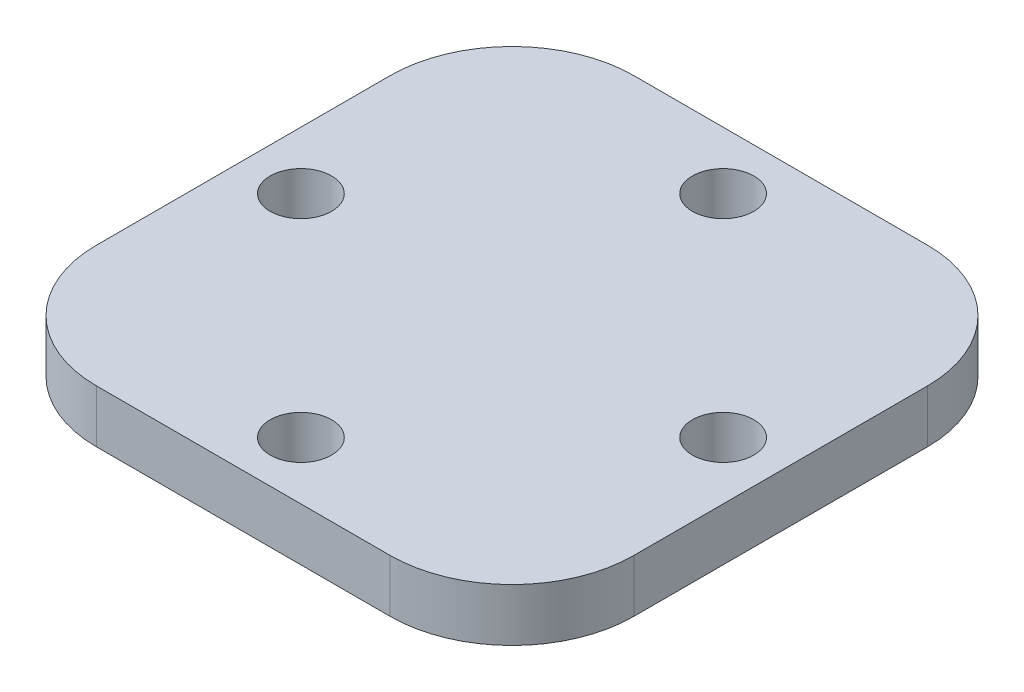
ISO-10303-21;
HEADER;
FILE_DESCRIPTION(('STEP AP214'),'2;1');
FILE_NAME('part.step','',(''),(''),'','','');
FILE_SCHEMA(('AUTOMOTIVE_DESIGN { 1 0 10303 214 1 1 1 1 }'));
ENDSEC;
DATA;
#1=APPLICATION_CONTEXT('core data for automotive mechanical design processes');
#2=APPLICATION_PROTOCOL_DEFINITION('international standard','automotive_design',2000,#1);
#3=PRODUCT_CONTEXT('',#1,'mechanical');
#4=PRODUCT('Part','Part','',(#3));
#5=PRODUCT_RELATED_PRODUCT_CATEGORY('part','',(#4));
#6=PRODUCT_DEFINITION_FORMATION('','',#4);
#7=PRODUCT_DEFINITION_CONTEXT('part definition',#1,'design');
#8=PRODUCT_DEFINITION('design','',#6,#7);
#9=PRODUCT_DEFINITION_SHAPE('','',#8);
#10=(LENGTH_UNIT() NAMED_UNIT(*) SI_UNIT(.MILLI.,.METRE.));
#11=(NAMED_UNIT(*) PLANE_ANGLE_UNIT() SI_UNIT($,.RADIAN.));
#12=(NAMED_UNIT(*) SI_UNIT($,.STERADIAN.) SOLID_ANGLE_UNIT());
#13=UNCERTAINTY_MEASURE_WITH_UNIT(LENGTH_MEASURE(1.E-05),#10,'distance_accuracy_value','');
#14=(GEOMETRIC_REPRESENTATION_CONTEXT(3) GLOBAL_UNCERTAINTY_ASSIGNED_CONTEXT((#13)) GLOBAL_UNIT_ASSIGNED_CONTEXT((#10,
#11,#12)) REPRESENTATION_CONTEXT('',''));
#15=CARTESIAN_POINT('',(0.,0.,0.));
#16=DIRECTION('',(0.,0.,1.));
#17=DIRECTION('',(1.,0.,0.));
#18=AXIS2_PLACEMENT_3D('',#15,#16,#17);
#19=CARTESIAN_POINT('',(7.65,2.75,-7.65));
#20=DIRECTION('',(0.,-1.,0.));
#21=DIRECTION('',(0.,0.,-1.));
#22=AXIS2_PLACEMENT_3D('',#19,#20,#21);
#23=PLANE('',#22);
#24=CARTESIAN_POINT('',(7.65,2.75,-7.65));
#25=DIRECTION('',(0.,1.,0.));
#26=DIRECTION('',(0.,0.,-1.));
#27=AXIS2_PLACEMENT_3D('',#24,#25,#26);
#28=CIRCLE('',#27,6.35);
#29=CARTESIAN_POINT('',(14.,2.75,-7.65));
#30=VERTEX_POINT('',#29);
#31=CARTESIAN_POINT('',(7.65,2.75,-14.));
#32=VERTEX_POINT('',#31);
#33=EDGE_CURVE('E148',#30,#32,#28,.T.);
#34=ORIENTED_EDGE('',*,*,#33,.T.);
#35=DIRECTION('',(-1.,0.,0.));
#36=VECTOR('',#35,1.);
#37=CARTESIAN_POINT('',(-7.65,2.75,-14.));
#38=LINE('',#37,#36);
#39=CARTESIAN_POINT('',(-7.65,2.75,-14.));
#40=VERTEX_POINT('',#39);
#41=EDGE_CURVE('E96',#32,#40,#38,.T.);
#42=ORIENTED_EDGE('',*,*,#41,.T.);
#43=CARTESIAN_POINT('',(-7.65,2.75,-7.65));
#44=DIRECTION('',(0.,1.,0.));
#45=DIRECTION('',(0.,0.,-1.));
#46=AXIS2_PLACEMENT_3D('',#43,#44,#45);
#47=CIRCLE('',#46,6.35);
#48=CARTESIAN_POINT('',(-14.,2.75,-7.65));
#49=VERTEX_POINT('',#48);
#50=EDGE_CURVE('E163',#40,#49,#47,.T.);
#51=ORIENTED_EDGE('',*,*,#50,.T.);
#52=DIRECTION('',(0.,0.,1.));
#53=VECTOR('',#52,1.);
#54=CARTESIAN_POINT('',(-14.,2.75,7.65));
#55=LINE('',#54,#53);
#56=CARTESIAN_POINT('',(-14.,2.75,7.65));
#57=VERTEX_POINT('',#56);
#58=EDGE_CURVE('E176',#49,#57,#55,.T.);
#59=ORIENTED_EDGE('',*,*,#58,.T.);
#60=CARTESIAN_POINT('',(-7.65,2.75,7.65));
#61=DIRECTION('',(0.,1.,0.));
#62=DIRECTION('',(0.,0.,-1.));
#63=AXIS2_PLACEMENT_3D('',#60,#61,#62);
#64=CIRCLE('',#63,6.35);
#65=CARTESIAN_POINT('',(-7.65,2.75,14.));
#66=VERTEX_POINT('',#65);
#67=EDGE_CURVE('E115',#57,#66,#64,.T.);
#68=ORIENTED_EDGE('',*,*,#67,.T.);
#69=DIRECTION('',(1.,0.,0.));
#70=VECTOR('',#69,1.);
#71=CARTESIAN_POINT('',(-7.65,2.75,14.));
#72=LINE('',#71,#70);
#73=CARTESIAN_POINT('',(7.65,2.75,14.));
#74=VERTEX_POINT('',#73);
#75=EDGE_CURVE('E109',#66,#74,#72,.T.);
#76=ORIENTED_EDGE('',*,*,#75,.T.);
#77=CARTESIAN_POINT('',(7.65,2.75,7.65));
#78=DIRECTION('',(0.,1.,0.));
#79=DIRECTION('',(0.,0.,-1.));
#80=AXIS2_PLACEMENT_3D('',#77,#78,#79);
#81=CIRCLE('',#80,6.35);
#82=CARTESIAN_POINT('',(14.,2.75,7.65));
#83=VERTEX_POINT('',#82);
#84=EDGE_CURVE('E113',#74,#83,#81,.T.);
#85=ORIENTED_EDGE('',*,*,#84,.T.);
#86=DIRECTION('',(0.,0.,-1.));
#87=VECTOR('',#86,1.);
#88=CARTESIAN_POINT('',(14.,2.75,7.65));
#89=LINE('',#88,#87);
#90=EDGE_CURVE('E53',#83,#30,#89,.T.);
#91=ORIENTED_EDGE('',*,*,#90,.T.);
#92=EDGE_LOOP('',(#34,#42,#51,#59,#68,#76,#85,#91));
#93=FACE_BOUND('',#92,.T.);
#94=CARTESIAN_POINT('',(-11.,2.75,0.));
#95=DIRECTION('',(0.,1.,0.));
#96=DIRECTION('',(0.,0.,1.));
#97=AXIS2_PLACEMENT_3D('',#94,#95,#96);
#98=CIRCLE('',#97,1.59999999999999);
#99=CARTESIAN_POINT('',(-11.,2.75,1.59999999999999));
#100=VERTEX_POINT('',#99);
#101=EDGE_CURVE('E137',#100,#100,#98,.T.);
#102=ORIENTED_EDGE('',*,*,#101,.F.);
#103=EDGE_LOOP('',(#102));
#104=FACE_BOUND('',#103,.T.);
#105=CARTESIAN_POINT('',(0.,2.75,11.));
#106=DIRECTION('',(0.,1.,0.));
#107=DIRECTION('',(0.,0.,1.));
#108=AXIS2_PLACEMENT_3D('',#105,#106,#107);
#109=CIRCLE('',#108,1.59999999999999);
#110=CARTESIAN_POINT('',(0.,2.75,12.6));
#111=VERTEX_POINT('',#110);
#112=EDGE_CURVE('E185',#111,#111,#109,.T.);
#113=ORIENTED_EDGE('',*,*,#112,.F.);
#114=EDGE_LOOP('',(#113));
#115=FACE_BOUND('',#114,.T.);
#116=CARTESIAN_POINT('',(11.,2.75,0.));
#117=DIRECTION('',(0.,1.,0.));
#118=DIRECTION('',(0.,0.,1.));
#119=AXIS2_PLACEMENT_3D('',#116,#117,#118);
#120=CIRCLE('',#119,1.6);
#121=CARTESIAN_POINT('',(11.,2.75,1.6));
#122=VERTEX_POINT('',#121);
#123=EDGE_CURVE('E191',#122,#122,#120,.T.);
#124=ORIENTED_EDGE('',*,*,#123,.F.);
#125=EDGE_LOOP('',(#124));
#126=FACE_BOUND('',#125,.T.);
#127=CARTESIAN_POINT('',(0.,2.75,-11.));
#128=DIRECTION('',(0.,1.,0.));
#129=DIRECTION('',(0.,0.,1.));
#130=AXIS2_PLACEMENT_3D('',#127,#128,#129);
#131=CIRCLE('',#130,1.6);
#132=CARTESIAN_POINT('',(0.,2.75,-9.4));
#133=VERTEX_POINT('',#132);
#134=EDGE_CURVE('E197',#133,#133,#131,.T.);
#135=ORIENTED_EDGE('',*,*,#134,.F.);
#136=EDGE_LOOP('',(#135));
#137=FACE_BOUND('',#136,.T.);
#138=ADVANCED_FACE('F36',(#93,#104,#115,#126,#137),#23,.F.);
#139=CARTESIAN_POINT('',(7.65,0.,-7.65));
#140=DIRECTION('',(0.,-1.,0.));
#141=DIRECTION('',(0.,0.,-1.));
#142=AXIS2_PLACEMENT_3D('',#139,#140,#141);
#143=PLANE('',#142);
#144=CARTESIAN_POINT('',(11.,0.,0.));
#145=DIRECTION('',(0.,1.,0.));
#146=DIRECTION('',(0.,0.,1.));
#147=AXIS2_PLACEMENT_3D('',#144,#145,#146);
#148=CIRCLE('',#147,1.6);
#149=CARTESIAN_POINT('',(11.,0.,1.6));
#150=VERTEX_POINT('',#149);
#151=EDGE_CURVE('E194',#150,#150,#148,.T.);
#152=ORIENTED_EDGE('',*,*,#151,.T.);
#153=EDGE_LOOP('',(#152));
#154=FACE_BOUND('',#153,.T.);
#155=CARTESIAN_POINT('',(-11.,0.,0.));
#156=DIRECTION('',(0.,1.,0.));
#157=DIRECTION('',(0.,0.,1.));
#158=AXIS2_PLACEMENT_3D('',#155,#156,#157);
#159=CIRCLE('',#158,1.59999999999999);
#160=CARTESIAN_POINT('',(-11.,0.,1.59999999999999));
#161=VERTEX_POINT('',#160);
#162=EDGE_CURVE('E182',#161,#161,#159,.T.);
#163=ORIENTED_EDGE('',*,*,#162,.T.);
#164=EDGE_LOOP('',(#163));
#165=FACE_BOUND('',#164,.T.);
#166=CARTESIAN_POINT('',(7.65,0.,-7.65));
#167=DIRECTION('',(0.,1.,0.));
#168=DIRECTION('',(0.,0.,-1.));
#169=AXIS2_PLACEMENT_3D('',#166,#167,#168);
#170=CIRCLE('',#169,6.35);
#171=CARTESIAN_POINT('',(14.,0.,-7.65));
#172=VERTEX_POINT('',#171);
#173=CARTESIAN_POINT('',(7.65,0.,-14.));
#174=VERTEX_POINT('',#173);
#175=EDGE_CURVE('E133',#172,#174,#170,.T.);
#176=ORIENTED_EDGE('',*,*,#175,.F.);
#177=DIRECTION('',(0.,0.,-1.));
#178=VECTOR('',#177,1.);
#179=CARTESIAN_POINT('',(14.,0.,7.65));
#180=LINE('',#179,#178);
#181=CARTESIAN_POINT('',(14.,0.,7.65));
#182=VERTEX_POINT('',#181);
#183=EDGE_CURVE('E88',#182,#172,#180,.T.);
#184=ORIENTED_EDGE('',*,*,#183,.F.);
#185=CARTESIAN_POINT('',(7.65,0.,7.65));
#186=DIRECTION('',(0.,1.,0.));
#187=DIRECTION('',(0.,0.,-1.));
#188=AXIS2_PLACEMENT_3D('',#185,#186,#187);
#189=CIRCLE('',#188,6.35);
#190=CARTESIAN_POINT('',(7.65,0.,14.));
#191=VERTEX_POINT('',#190);
#192=EDGE_CURVE('E82',#191,#182,#189,.T.);
#193=ORIENTED_EDGE('',*,*,#192,.F.);
#194=DIRECTION('',(1.,0.,0.));
#195=VECTOR('',#194,1.);
#196=CARTESIAN_POINT('',(-7.65,0.,14.));
#197=LINE('',#196,#195);
#198=CARTESIAN_POINT('',(-7.65,0.,14.));
#199=VERTEX_POINT('',#198);
#200=EDGE_CURVE('E123',#199,#191,#197,.T.);
#201=ORIENTED_EDGE('',*,*,#200,.F.);
#202=CARTESIAN_POINT('',(-7.65,0.,7.65));
#203=DIRECTION('',(0.,1.,0.));
#204=DIRECTION('',(0.,0.,-1.));
#205=AXIS2_PLACEMENT_3D('',#202,#203,#204);
#206=CIRCLE('',#205,6.35);
#207=CARTESIAN_POINT('',(-14.,0.,7.65));
#208=VERTEX_POINT('',#207);
#209=EDGE_CURVE('E143',#208,#199,#206,.T.);
#210=ORIENTED_EDGE('',*,*,#209,.F.);
#211=DIRECTION('',(0.,0.,1.));
#212=VECTOR('',#211,1.);
#213=CARTESIAN_POINT('',(-14.,0.,7.65));
#214=LINE('',#213,#212);
#215=CARTESIAN_POINT('',(-14.,0.,-7.65));
#216=VERTEX_POINT('',#215);
#217=EDGE_CURVE('E141',#216,#208,#214,.T.);
#218=ORIENTED_EDGE('',*,*,#217,.F.);
#219=CARTESIAN_POINT('',(-7.65,0.,-7.65));
#220=DIRECTION('',(0.,1.,0.));
#221=DIRECTION('',(0.,0.,-1.));
#222=AXIS2_PLACEMENT_3D('',#219,#220,#221);
#223=CIRCLE('',#222,6.35);
#224=CARTESIAN_POINT('',(-7.65,0.,-14.));
#225=VERTEX_POINT('',#224);
#226=EDGE_CURVE('E139',#225,#216,#223,.T.);
#227=ORIENTED_EDGE('',*,*,#226,.F.);
#228=DIRECTION('',(-1.,0.,0.));
#229=VECTOR('',#228,1.);
#230=CARTESIAN_POINT('',(-7.65,0.,-14.));
#231=LINE('',#230,#229);
#232=EDGE_CURVE('E136',#174,#225,#231,.T.);
#233=ORIENTED_EDGE('',*,*,#232,.F.);
#234=EDGE_LOOP('',(#176,#184,#193,#201,#210,#218,#227,#233));
#235=FACE_BOUND('',#234,.T.);
#236=CARTESIAN_POINT('',(0.,0.,11.));
#237=DIRECTION('',(0.,1.,0.));
#238=DIRECTION('',(0.,0.,1.));
#239=AXIS2_PLACEMENT_3D('',#236,#237,#238);
#240=CIRCLE('',#239,1.59999999999999);
#241=CARTESIAN_POINT('',(0.,0.,12.6));
#242=VERTEX_POINT('',#241);
#243=EDGE_CURVE('E188',#242,#242,#240,.T.);
#244=ORIENTED_EDGE('',*,*,#243,.T.);
#245=EDGE_LOOP('',(#244));
#246=FACE_BOUND('',#245,.T.);
#247=CARTESIAN_POINT('',(0.,0.,-11.));
#248=DIRECTION('',(0.,1.,0.));
#249=DIRECTION('',(0.,0.,1.));
#250=AXIS2_PLACEMENT_3D('',#247,#248,#249);
#251=CIRCLE('',#250,1.6);
#252=CARTESIAN_POINT('',(0.,0.,-9.4));
#253=VERTEX_POINT('',#252);
#254=EDGE_CURVE('E200',#253,#253,#251,.T.);
#255=ORIENTED_EDGE('',*,*,#254,.T.);
#256=EDGE_LOOP('',(#255));
#257=FACE_BOUND('',#256,.T.);
#258=ADVANCED_FACE('F167',(#154,#165,#235,#246,#257),#143,.T.);
#259=CARTESIAN_POINT('',(7.65,2.75,-7.65));
#260=DIRECTION('',(0.,-1.,0.));
#261=DIRECTION('',(0.,0.,-1.));
#262=AXIS2_PLACEMENT_3D('',#259,#260,#261);
#263=CYLINDRICAL_SURFACE('',#262,6.35);
#264=ORIENTED_EDGE('',*,*,#175,.T.);
#265=DIRECTION('',(0.,-1.,0.));
#266=VECTOR('',#265,1.);
#267=CARTESIAN_POINT('',(7.65,2.75,-14.));
#268=LINE('',#267,#266);
#269=EDGE_CURVE('E11',#32,#174,#268,.T.);
#270=ORIENTED_EDGE('',*,*,#269,.F.);
#271=ORIENTED_EDGE('',*,*,#33,.F.);
#272=DIRECTION('',(0.,-1.,0.));
#273=VECTOR('',#272,1.);
#274=CARTESIAN_POINT('',(14.,2.75,-7.65));
#275=LINE('',#274,#273);
#276=EDGE_CURVE('E129',#30,#172,#275,.T.);
#277=ORIENTED_EDGE('',*,*,#276,.T.);
#278=EDGE_LOOP('',(#264,#270,#271,#277));
#279=FACE_BOUND('',#278,.T.);
#280=ADVANCED_FACE('F38',(#279),#263,.T.);
#281=CARTESIAN_POINT('',(-7.65,2.75,-14.));
#282=DIRECTION('',(0.,0.,1.));
#283=DIRECTION('',(1.,0.,0.));
#284=AXIS2_PLACEMENT_3D('',#281,#282,#283);
#285=PLANE('',#284);
#286=ORIENTED_EDGE('',*,*,#232,.T.);
#287=DIRECTION('',(0.,-1.,0.));
#288=VECTOR('',#287,1.);
#289=CARTESIAN_POINT('',(-7.65,2.75,-14.));
#290=LINE('',#289,#288);
#291=EDGE_CURVE('E45',#40,#225,#290,.T.);
#292=ORIENTED_EDGE('',*,*,#291,.F.);
#293=ORIENTED_EDGE('',*,*,#41,.F.);
#294=ORIENTED_EDGE('',*,*,#269,.T.);
#295=EDGE_LOOP('',(#286,#292,#293,#294));
#296=FACE_BOUND('',#295,.T.);
#297=ADVANCED_FACE('F232',(#296),#285,.F.);
#298=CARTESIAN_POINT('',(-7.65,2.75,-7.65));
#299=DIRECTION('',(0.,-1.,0.));
#300=DIRECTION('',(0.,0.,-1.));
#301=AXIS2_PLACEMENT_3D('',#298,#299,#300);
#302=CYLINDRICAL_SURFACE('',#301,6.35);
#303=ORIENTED_EDGE('',*,*,#226,.T.);
#304=DIRECTION('',(0.,-1.,0.));
#305=VECTOR('',#304,1.);
#306=CARTESIAN_POINT('',(-14.,2.75,-7.65));
#307=LINE('',#306,#305);
#308=EDGE_CURVE('E155',#49,#216,#307,.T.);
#309=ORIENTED_EDGE('',*,*,#308,.F.);
#310=ORIENTED_EDGE('',*,*,#50,.F.);
#311=ORIENTED_EDGE('',*,*,#291,.T.);
#312=EDGE_LOOP('',(#303,#309,#310,#311));
#313=FACE_BOUND('',#312,.T.);
#314=ADVANCED_FACE('F161',(#313),#302,.T.);
#315=CARTESIAN_POINT('',(-14.,2.75,7.65));
#316=DIRECTION('',(1.,0.,0.));
#317=DIRECTION('',(0.,0.,-1.));
#318=AXIS2_PLACEMENT_3D('',#315,#316,#317);
#319=PLANE('',#318);
#320=ORIENTED_EDGE('',*,*,#217,.T.);
#321=DIRECTION('',(0.,-1.,0.));
#322=VECTOR('',#321,1.);
#323=CARTESIAN_POINT('',(-14.,2.75,7.65));
#324=LINE('',#323,#322);
#325=EDGE_CURVE('E152',#57,#208,#324,.T.);
#326=ORIENTED_EDGE('',*,*,#325,.F.);
#327=ORIENTED_EDGE('',*,*,#58,.F.);
#328=ORIENTED_EDGE('',*,*,#308,.T.);
#329=EDGE_LOOP('',(#320,#326,#327,#328));
#330=FACE_BOUND('',#329,.T.);
#331=ADVANCED_FACE('F172',(#330),#319,.F.);
#332=CARTESIAN_POINT('',(-7.65,2.75,7.65));
#333=DIRECTION('',(0.,-1.,0.));
#334=DIRECTION('',(0.,0.,-1.));
#335=AXIS2_PLACEMENT_3D('',#332,#333,#334);
#336=CYLINDRICAL_SURFACE('',#335,6.35);
#337=ORIENTED_EDGE('',*,*,#209,.T.);
#338=DIRECTION('',(0.,-1.,0.));
#339=VECTOR('',#338,1.);
#340=CARTESIAN_POINT('',(-7.65,2.75,14.));
#341=LINE('',#340,#339);
#342=EDGE_CURVE('E124',#66,#199,#341,.T.);
#343=ORIENTED_EDGE('',*,*,#342,.F.);
#344=ORIENTED_EDGE('',*,*,#67,.F.);
#345=ORIENTED_EDGE('',*,*,#325,.T.);
#346=EDGE_LOOP('',(#337,#343,#344,#345));
#347=FACE_BOUND('',#346,.T.);
#348=ADVANCED_FACE('F175',(#347),#336,.T.);
#349=CARTESIAN_POINT('',(-7.65,2.75,14.));
#350=DIRECTION('',(0.,0.,-1.));
#351=DIRECTION('',(-1.,0.,0.));
#352=AXIS2_PLACEMENT_3D('',#349,#350,#351);
#353=PLANE('',#352);
#354=ORIENTED_EDGE('',*,*,#200,.T.);
#355=DIRECTION('',(0.,-1.,0.));
#356=VECTOR('',#355,1.);
#357=CARTESIAN_POINT('',(7.65,2.75,14.));
#358=LINE('',#357,#356);
#359=EDGE_CURVE('E120',#74,#191,#358,.T.);
#360=ORIENTED_EDGE('',*,*,#359,.F.);
#361=ORIENTED_EDGE('',*,*,#75,.F.);
#362=ORIENTED_EDGE('',*,*,#342,.T.);
#363=EDGE_LOOP('',(#354,#360,#361,#362));
#364=FACE_BOUND('',#363,.T.);
#365=ADVANCED_FACE('F121',(#364),#353,.F.);
#366=CARTESIAN_POINT('',(7.65,2.75,7.65));
#367=DIRECTION('',(0.,-1.,0.));
#368=DIRECTION('',(0.,0.,-1.));
#369=AXIS2_PLACEMENT_3D('',#366,#367,#368);
#370=CYLINDRICAL_SURFACE('',#369,6.35);
#371=ORIENTED_EDGE('',*,*,#192,.T.);
#372=DIRECTION('',(0.,-1.,0.));
#373=VECTOR('',#372,1.);
#374=CARTESIAN_POINT('',(14.,2.75,7.65));
#375=LINE('',#374,#373);
#376=EDGE_CURVE('E125',#83,#182,#375,.T.);
#377=ORIENTED_EDGE('',*,*,#376,.F.);
#378=ORIENTED_EDGE('',*,*,#84,.F.);
#379=ORIENTED_EDGE('',*,*,#359,.T.);
#380=EDGE_LOOP('',(#371,#377,#378,#379));
#381=FACE_BOUND('',#380,.T.);
#382=ADVANCED_FACE('F127',(#381),#370,.T.);
#383=CARTESIAN_POINT('',(14.,2.75,7.65));
#384=DIRECTION('',(-1.,0.,0.));
#385=DIRECTION('',(0.,0.,1.));
#386=AXIS2_PLACEMENT_3D('',#383,#384,#385);
#387=PLANE('',#386);
#388=ORIENTED_EDGE('',*,*,#183,.T.);
#389=ORIENTED_EDGE('',*,*,#276,.F.);
#390=ORIENTED_EDGE('',*,*,#90,.F.);
#391=ORIENTED_EDGE('',*,*,#376,.T.);
#392=EDGE_LOOP('',(#388,#389,#390,#391));
#393=FACE_BOUND('',#392,.T.);
#394=ADVANCED_FACE('F220',(#393),#387,.F.);
#395=CARTESIAN_POINT('',(-11.,2.75,0.));
#396=DIRECTION('',(0.,-1.,0.));
#397=DIRECTION('',(0.,0.,-1.));
#398=AXIS2_PLACEMENT_3D('',#395,#396,#397);
#399=CYLINDRICAL_SURFACE('',#398,1.59999999999999);
#400=ORIENTED_EDGE('',*,*,#101,.T.);
#401=EDGE_LOOP('',(#400));
#402=FACE_BOUND('',#401,.T.);
#403=ORIENTED_EDGE('',*,*,#162,.F.);
#404=EDGE_LOOP('',(#403));
#405=FACE_BOUND('',#404,.T.);
#406=ADVANCED_FACE('F217',(#402,#405),#399,.F.);
#407=CARTESIAN_POINT('',(0.,2.75,11.));
#408=DIRECTION('',(0.,-1.,0.));
#409=DIRECTION('',(0.,0.,-1.));
#410=AXIS2_PLACEMENT_3D('',#407,#408,#409);
#411=CYLINDRICAL_SURFACE('',#410,1.59999999999999);
#412=ORIENTED_EDGE('',*,*,#112,.T.);
#413=EDGE_LOOP('',(#412));
#414=FACE_BOUND('',#413,.T.);
#415=ORIENTED_EDGE('',*,*,#243,.F.);
#416=EDGE_LOOP('',(#415));
#417=FACE_BOUND('',#416,.T.);
#418=ADVANCED_FACE('F296',(#414,#417),#411,.F.);
#419=CARTESIAN_POINT('',(11.,2.75,0.));
#420=DIRECTION('',(0.,-1.,0.));
#421=DIRECTION('',(0.,0.,-1.));
#422=AXIS2_PLACEMENT_3D('',#419,#420,#421);
#423=CYLINDRICAL_SURFACE('',#422,1.6);
#424=ORIENTED_EDGE('',*,*,#123,.T.);
#425=EDGE_LOOP('',(#424));
#426=FACE_BOUND('',#425,.T.);
#427=ORIENTED_EDGE('',*,*,#151,.F.);
#428=EDGE_LOOP('',(#427));
#429=FACE_BOUND('',#428,.T.);
#430=ADVANCED_FACE('F304',(#426,#429),#423,.F.);
#431=CARTESIAN_POINT('',(0.,2.75,-11.));
#432=DIRECTION('',(0.,-1.,0.));
#433=DIRECTION('',(0.,0.,-1.));
#434=AXIS2_PLACEMENT_3D('',#431,#432,#433);
#435=CYLINDRICAL_SURFACE('',#434,1.6);
#436=ORIENTED_EDGE('',*,*,#134,.T.);
#437=EDGE_LOOP('',(#436));
#438=FACE_BOUND('',#437,.T.);
#439=ORIENTED_EDGE('',*,*,#254,.F.);
#440=EDGE_LOOP('',(#439));
#441=FACE_BOUND('',#440,.T.);
#442=ADVANCED_FACE('F206',(#438,#441),#435,.F.);
#443=CLOSED_SHELL('',(#138,#258,#280,#297,#314,#331,#348,#365,#382,#394,#406,#418,#430,#442));
#444=MANIFOLD_SOLID_BREP('B2',#443);
#445=ADVANCED_BREP_SHAPE_REPRESENTATION('',(#18,#444),#14);
#446=SHAPE_DEFINITION_REPRESENTATION(#9,#445);
ENDSEC;
END-ISO-10303-21;
